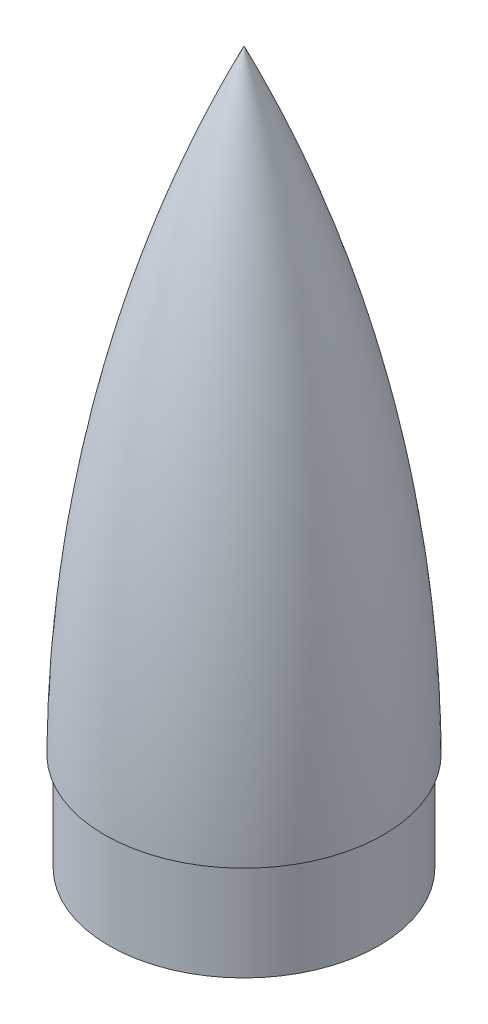
ISO-10303-21;
HEADER;
FILE_DESCRIPTION(('STEP AP214'),'2;1');
FILE_NAME('part.step','',(''),(''),'','','');
FILE_SCHEMA(('AUTOMOTIVE_DESIGN { 1 0 10303 214 1 1 1 1 }'));
ENDSEC;
DATA;
#1=APPLICATION_CONTEXT('core data for automotive mechanical design processes');
#2=APPLICATION_PROTOCOL_DEFINITION('international standard','automotive_design',2000,#1);
#3=PRODUCT_CONTEXT('',#1,'mechanical');
#4=PRODUCT('Part','Part','',(#3));
#5=PRODUCT_RELATED_PRODUCT_CATEGORY('part','',(#4));
#6=PRODUCT_DEFINITION_FORMATION('','',#4);
#7=PRODUCT_DEFINITION_CONTEXT('part definition',#1,'design');
#8=PRODUCT_DEFINITION('design','',#6,#7);
#9=PRODUCT_DEFINITION_SHAPE('','',#8);
#10=(LENGTH_UNIT() NAMED_UNIT(*) SI_UNIT(.MILLI.,.METRE.));
#11=(NAMED_UNIT(*) PLANE_ANGLE_UNIT() SI_UNIT($,.RADIAN.));
#12=(NAMED_UNIT(*) SI_UNIT($,.STERADIAN.) SOLID_ANGLE_UNIT());
#13=UNCERTAINTY_MEASURE_WITH_UNIT(LENGTH_MEASURE(1.E-05),#10,'distance_accuracy_value','');
#14=(GEOMETRIC_REPRESENTATION_CONTEXT(3) GLOBAL_UNCERTAINTY_ASSIGNED_CONTEXT((#13)) GLOBAL_UNIT_ASSIGNED_CONTEXT((#10,
#11,#12)) REPRESENTATION_CONTEXT('',''));
#15=CARTESIAN_POINT('',(0.,0.,0.));
#16=DIRECTION('',(0.,0.,1.));
#17=DIRECTION('',(1.,0.,0.));
#18=AXIS2_PLACEMENT_3D('',#15,#16,#17);
#19=CARTESIAN_POINT('',(0.,0.,-55.));
#20=DIRECTION('',(0.,-1.,0.));
#21=DIRECTION('',(0.,0.,-1.));
#22=AXIS2_PLACEMENT_3D('',#19,#20,#21);
#23=PLANE('',#22);
#24=CARTESIAN_POINT('',(0.,0.,0.));
#25=DIRECTION('',(0.,-1.,0.));
#26=DIRECTION('',(0.,0.,-1.));
#27=AXIS2_PLACEMENT_3D('',#24,#25,#26);
#28=CIRCLE('',#27,55.);
#29=CARTESIAN_POINT('',(0.,0.,-55.));
#30=VERTEX_POINT('',#29);
#31=EDGE_CURVE('E11',#30,#30,#28,.T.);
#32=ORIENTED_EDGE('',*,*,#31,.T.);
#33=EDGE_LOOP('',(#32));
#34=FACE_BOUND('',#33,.T.);
#35=ADVANCED_FACE('F42',(#34),#23,.T.);
#36=CARTESIAN_POINT('',(0.,0.,0.));
#37=DIRECTION('',(0.,-1.,0.));
#38=DIRECTION('',(0.,0.,-1.));
#39=AXIS2_PLACEMENT_3D('',#36,#37,#38);
#40=CYLINDRICAL_SURFACE('',#39,55.);
#41=CARTESIAN_POINT('',(0.,40.,0.));
#42=DIRECTION('',(0.,-1.,0.));
#43=DIRECTION('',(0.,0.,-1.));
#44=AXIS2_PLACEMENT_3D('',#41,#42,#43);
#45=CIRCLE('',#44,55.);
#46=CARTESIAN_POINT('',(0.,40.,-55.));
#47=VERTEX_POINT('',#46);
#48=EDGE_CURVE('E50',#47,#47,#45,.T.);
#49=ORIENTED_EDGE('',*,*,#48,.T.);
#50=EDGE_LOOP('',(#49));
#51=FACE_BOUND('',#50,.T.);
#52=ORIENTED_EDGE('',*,*,#31,.F.);
#53=EDGE_LOOP('',(#52));
#54=FACE_BOUND('',#53,.T.);
#55=ADVANCED_FACE('F94',(#51,#54),#40,.T.);
#56=CARTESIAN_POINT('',(0.,40.,-55.));
#57=DIRECTION('',(0.,-1.,0.));
#58=DIRECTION('',(0.,0.,-1.));
#59=AXIS2_PLACEMENT_3D('',#56,#57,#58);
#60=PLANE('',#59);
#61=CARTESIAN_POINT('',(0.,40.,0.));
#62=DIRECTION('',(0.,-1.,0.));
#63=DIRECTION('',(0.,0.,-1.));
#64=AXIS2_PLACEMENT_3D('',#61,#62,#63);
#65=CIRCLE('',#64,56.8);
#66=CARTESIAN_POINT('',(0.,40.,-56.8));
#67=VERTEX_POINT('',#66);
#68=EDGE_CURVE('E63',#67,#67,#65,.T.);
#69=ORIENTED_EDGE('',*,*,#68,.T.);
#70=EDGE_LOOP('',(#69));
#71=FACE_BOUND('',#70,.T.);
#72=ORIENTED_EDGE('',*,*,#48,.F.);
#73=EDGE_LOOP('',(#72));
#74=FACE_BOUND('',#73,.T.);
#75=ADVANCED_FACE('F59',(#71,#74),#60,.T.);
#76=CARTESIAN_POINT('',(0.,36.1164471617856,538.869158618901));
#77=DIRECTION('',(-1.,0.,0.));
#78=DIRECTION('',(0.,0.,-1.));
#79=AXIS2_PLACEMENT_3D('',#76,#77,#78);
#80=CIRCLE('',#79,595.681818181818);
#81=TRIMMED_CURVE('',#80,(PARAMETER_VALUE(-0.440295334739211)),
(PARAMETER_VALUE(0.440295334739211)),.T.,.PARAMETER.);
#82=CARTESIAN_POINT('',(0.,36.1164471617856,0.));
#83=DIRECTION('',(0.,-1.,0.));
#84=AXIS1_PLACEMENT('',#82,#83);
#85=SURFACE_OF_REVOLUTION('',#81,#84);
#86=CARTESIAN_POINT('',(0.,290.,0.));
#87=VERTEX_POINT('',#86);
#88=VERTEX_LOOP('',#87);
#89=FACE_BOUND('',#88,.T.);
#90=ORIENTED_EDGE('',*,*,#68,.F.);
#91=EDGE_LOOP('',(#90));
#92=FACE_BOUND('',#91,.T.);
#93=ADVANCED_FACE('F56',(#89,#92),#85,.T.);
#94=CLOSED_SHELL('',(#35,#55,#75,#93));
#95=CARTESIAN_POINT('',(0.,36.1164471617856,538.869158618901));
#96=DIRECTION('',(-1.,0.,0.));
#97=DIRECTION('',(0.,0.,-1.));
#98=AXIS2_PLACEMENT_3D('',#95,#96,#97);
#99=CIRCLE('',#98,592.681818181818);
#100=TRIMMED_CURVE('',#99,(PARAMETER_VALUE(-0.429426182314728)),
(PARAMETER_VALUE(0.429426182314728)),.T.,.PARAMETER.);
#101=CARTESIAN_POINT('',(0.,36.1164471617856,0.));
#102=DIRECTION('',(0.,-1.,0.));
#103=AXIS1_PLACEMENT('',#101,#102);
#104=SURFACE_OF_REVOLUTION('',#100,#103);
#105=CARTESIAN_POINT('',(0.,103.234638665826,0.));
#106=DIRECTION('',(0.,-1.,0.));
#107=DIRECTION('',(0.,0.,-1.));
#108=AXIS2_PLACEMENT_3D('',#105,#106,#107);
#109=CIRCLE('',#108,50.);
#110=CARTESIAN_POINT('',(0.,103.234638665826,-50.));
#111=VERTEX_POINT('',#110);
#112=EDGE_CURVE('E65',#111,#111,#109,.T.);
#113=ORIENTED_EDGE('',*,*,#112,.T.);
#114=EDGE_LOOP('',(#113));
#115=FACE_BOUND('',#114,.T.);
#116=CARTESIAN_POINT('',(0.,282.879020281502,0.));
#117=VERTEX_POINT('',#116);
#118=VERTEX_LOOP('',#117);
#119=FACE_BOUND('',#118,.T.);
#120=ADVANCED_FACE('F85',(#115,#119),#104,.F.);
#121=CARTESIAN_POINT('',(0.,0.,0.));
#122=DIRECTION('',(0.,-1.,0.));
#123=DIRECTION('',(0.,0.,-1.));
#124=AXIS2_PLACEMENT_3D('',#121,#122,#123);
#125=CYLINDRICAL_SURFACE('',#124,50.);
#126=CARTESIAN_POINT('',(0.,12.,0.));
#127=DIRECTION('',(0.,-1.,0.));
#128=DIRECTION('',(0.,0.,-1.));
#129=AXIS2_PLACEMENT_3D('',#126,#127,#128);
#130=CIRCLE('',#129,50.);
#131=CARTESIAN_POINT('',(0.,12.,-50.));
#132=VERTEX_POINT('',#131);
#133=EDGE_CURVE('E69',#132,#132,#130,.T.);
#134=ORIENTED_EDGE('',*,*,#133,.T.);
#135=EDGE_LOOP('',(#134));
#136=FACE_BOUND('',#135,.T.);
#137=ORIENTED_EDGE('',*,*,#112,.F.);
#138=EDGE_LOOP('',(#137));
#139=FACE_BOUND('',#138,.T.);
#140=ADVANCED_FACE('F75',(#136,#139),#125,.F.);
#141=CARTESIAN_POINT('',(0.,12.,0.));
#142=DIRECTION('',(0.,1.,0.));
#143=DIRECTION('',(0.,0.,1.));
#144=AXIS2_PLACEMENT_3D('',#141,#142,#143);
#145=PLANE('',#144);
#146=ORIENTED_EDGE('',*,*,#133,.F.);
#147=EDGE_LOOP('',(#146));
#148=FACE_BOUND('',#147,.T.);
#149=ADVANCED_FACE('F78',(#148),#145,.T.);
#150=CLOSED_SHELL('',(#120,#140,#149));
#151=ORIENTED_CLOSED_SHELL('',*,#150,.T.);
#152=BREP_WITH_VOIDS('B2',#94,(#151));
#153=ADVANCED_BREP_SHAPE_REPRESENTATION('',(#18,#152),#14);
#154=SHAPE_DEFINITION_REPRESENTATION(#9,#153);
ENDSEC;
END-ISO-10303-21;
